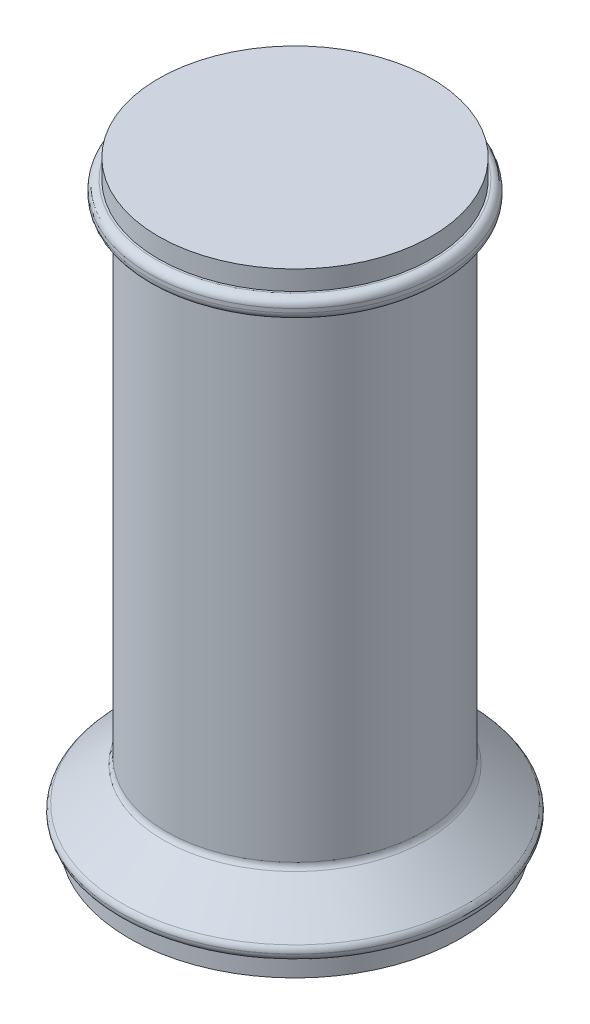
ISO-10303-21;
HEADER;
FILE_DESCRIPTION(('STEP AP214'),'2;1');
FILE_NAME('part.step','',(''),(''),'','','');
FILE_SCHEMA(('AUTOMOTIVE_DESIGN { 1 0 10303 214 1 1 1 1 }'));
ENDSEC;
DATA;
#1=APPLICATION_CONTEXT('core data for automotive mechanical design processes');
#2=APPLICATION_PROTOCOL_DEFINITION('international standard','automotive_design',2000,#1);
#3=PRODUCT_CONTEXT('',#1,'mechanical');
#4=PRODUCT('Part','Part','',(#3));
#5=PRODUCT_RELATED_PRODUCT_CATEGORY('part','',(#4));
#6=PRODUCT_DEFINITION_FORMATION('','',#4);
#7=PRODUCT_DEFINITION_CONTEXT('part definition',#1,'design');
#8=PRODUCT_DEFINITION('design','',#6,#7);
#9=PRODUCT_DEFINITION_SHAPE('','',#8);
#10=(LENGTH_UNIT() NAMED_UNIT(*) SI_UNIT(.MILLI.,.METRE.));
#11=(NAMED_UNIT(*) PLANE_ANGLE_UNIT() SI_UNIT($,.RADIAN.));
#12=(NAMED_UNIT(*) SI_UNIT($,.STERADIAN.) SOLID_ANGLE_UNIT());
#13=UNCERTAINTY_MEASURE_WITH_UNIT(LENGTH_MEASURE(1.E-05),#10,'distance_accuracy_value','');
#14=(GEOMETRIC_REPRESENTATION_CONTEXT(3) GLOBAL_UNCERTAINTY_ASSIGNED_CONTEXT((#13)) GLOBAL_UNIT_ASSIGNED_CONTEXT((#10,
#11,#12)) REPRESENTATION_CONTEXT('',''));
#15=CARTESIAN_POINT('',(0.,0.,0.));
#16=DIRECTION('',(0.,0.,1.));
#17=DIRECTION('',(1.,0.,0.));
#18=AXIS2_PLACEMENT_3D('',#15,#16,#17);
#19=CARTESIAN_POINT('',(0.,5.,0.));
#20=DIRECTION('',(0.,-1.,0.));
#21=DIRECTION('',(0.,0.,-1.));
#22=AXIS2_PLACEMENT_3D('',#19,#20,#21);
#23=CYLINDRICAL_SURFACE('',#22,42.5);
#24=CARTESIAN_POINT('',(0.,5.,0.));
#25=DIRECTION('',(0.,1.,0.));
#26=DIRECTION('',(0.,0.,1.));
#27=AXIS2_PLACEMENT_3D('',#24,#25,#26);
#28=CIRCLE('',#27,42.5);
#29=CARTESIAN_POINT('',(0.,5.,42.5));
#30=VERTEX_POINT('',#29);
#31=EDGE_CURVE('E80',#30,#30,#28,.T.);
#32=ORIENTED_EDGE('',*,*,#31,.F.);
#33=EDGE_LOOP('',(#32));
#34=FACE_BOUND('',#33,.T.);
#35=CARTESIAN_POINT('',(0.,0.,0.));
#36=DIRECTION('',(0.,1.,0.));
#37=DIRECTION('',(0.,0.,1.));
#38=AXIS2_PLACEMENT_3D('',#35,#36,#37);
#39=CIRCLE('',#38,42.5);
#40=CARTESIAN_POINT('',(0.,0.,42.5));
#41=VERTEX_POINT('',#40);
#42=EDGE_CURVE('E81',#41,#41,#39,.T.);
#43=ORIENTED_EDGE('',*,*,#42,.T.);
#44=EDGE_LOOP('',(#43));
#45=FACE_BOUND('',#44,.T.);
#46=ADVANCED_FACE('F36',(#34,#45),#23,.T.);
#47=CARTESIAN_POINT('',(0.,0.,0.));
#48=DIRECTION('',(0.,1.,0.));
#49=DIRECTION('',(0.,0.,1.));
#50=AXIS2_PLACEMENT_3D('',#47,#48,#49);
#51=PLANE('',#50);
#52=ORIENTED_EDGE('',*,*,#42,.F.);
#53=EDGE_LOOP('',(#52));
#54=FACE_BOUND('',#53,.T.);
#55=ADVANCED_FACE('F116',(#54),#51,.F.);
#56=CARTESIAN_POINT('',(0.,8.,0.));
#57=DIRECTION('',(0.,-1.,0.));
#58=DIRECTION('',(0.,0.,-1.));
#59=AXIS2_PLACEMENT_3D('',#56,#57,#58);
#60=CYLINDRICAL_SURFACE('',#59,45.);
#61=CARTESIAN_POINT('',(0.,7.,0.));
#62=DIRECTION('',(0.,1.,0.));
#63=DIRECTION('',(0.,0.,1.));
#64=AXIS2_PLACEMENT_3D('',#61,#62,#63);
#65=CIRCLE('',#64,45.);
#66=CARTESIAN_POINT('',(0.,7.,45.));
#67=VERTEX_POINT('',#66);
#68=EDGE_CURVE('E74',#67,#67,#65,.T.);
#69=ORIENTED_EDGE('',*,*,#68,.T.);
#70=EDGE_LOOP('',(#69));
#71=FACE_BOUND('',#70,.T.);
#72=CARTESIAN_POINT('',(0.,7.06325010803112,0.));
#73=DIRECTION('',(0.,-1.,0.));
#74=DIRECTION('',(0.,0.,-1.));
#75=AXIS2_PLACEMENT_3D('',#72,#73,#74);
#76=CIRCLE('',#75,45.);
#77=CARTESIAN_POINT('',(0.,7.06325010803112,-45.));
#78=VERTEX_POINT('',#77);
#79=EDGE_CURVE('E77',#78,#78,#76,.T.);
#80=ORIENTED_EDGE('',*,*,#79,.T.);
#81=EDGE_LOOP('',(#80));
#82=FACE_BOUND('',#81,.T.);
#83=ADVANCED_FACE('F122',(#71,#82),#60,.T.);
#84=CARTESIAN_POINT('',(0.,5.,0.));
#85=DIRECTION('',(0.,1.,0.));
#86=DIRECTION('',(0.,0.,1.));
#87=AXIS2_PLACEMENT_3D('',#84,#85,#86);
#88=PLANE('',#87);
#89=CARTESIAN_POINT('',(0.,5.,0.));
#90=DIRECTION('',(0.,1.,0.));
#91=DIRECTION('',(0.,0.,1.));
#92=AXIS2_PLACEMENT_3D('',#89,#90,#91);
#93=CIRCLE('',#92,43.);
#94=CARTESIAN_POINT('',(0.,5.,43.));
#95=VERTEX_POINT('',#94);
#96=EDGE_CURVE('E71',#95,#95,#93,.F.);
#97=ORIENTED_EDGE('',*,*,#96,.T.);
#98=EDGE_LOOP('',(#97));
#99=FACE_BOUND('',#98,.T.);
#100=ORIENTED_EDGE('',*,*,#31,.T.);
#101=EDGE_LOOP('',(#100));
#102=FACE_BOUND('',#101,.T.);
#103=ADVANCED_FACE('F228',(#99,#102),#88,.F.);
#104=CARTESIAN_POINT('',(0.,18.,0.));
#105=DIRECTION('',(0.,-1.,0.));
#106=DIRECTION('',(0.,0.,-1.));
#107=AXIS2_PLACEMENT_3D('',#104,#105,#106);
#108=CONICAL_SURFACE('',#107,33.,0.876058050598193);
#109=CARTESIAN_POINT('',(0.,8.59969266722588,0.));
#110=DIRECTION('',(0.,-1.,0.));
#111=DIRECTION('',(0.,0.,-1.));
#112=AXIS2_PLACEMENT_3D('',#109,#110,#111);
#113=CIRCLE('',#112,44.280368799329);
#114=CARTESIAN_POINT('',(0.,8.59969266722588,-44.280368799329));
#115=VERTEX_POINT('',#114);
#116=EDGE_CURVE('E65',#115,#115,#113,.F.);
#117=ORIENTED_EDGE('',*,*,#116,.T.);
#118=EDGE_LOOP('',(#117));
#119=FACE_BOUND('',#118,.T.);
#120=CARTESIAN_POINT('',(0.,17.4003073327741,0.));
#121=DIRECTION('',(0.,1.,0.));
#122=DIRECTION('',(0.,0.,1.));
#123=AXIS2_PLACEMENT_3D('',#120,#121,#122);
#124=CIRCLE('',#123,33.7196312006711);
#125=CARTESIAN_POINT('',(0.,17.4003073327741,33.7196312006711));
#126=VERTEX_POINT('',#125);
#127=EDGE_CURVE('E68',#126,#126,#124,.F.);
#128=ORIENTED_EDGE('',*,*,#127,.T.);
#129=EDGE_LOOP('',(#128));
#130=FACE_BOUND('',#129,.T.);
#131=ADVANCED_FACE('F219',(#119,#130),#108,.T.);
#132=CARTESIAN_POINT('',(0.,142.,0.));
#133=DIRECTION('',(0.,-1.,0.));
#134=DIRECTION('',(0.,0.,-1.));
#135=AXIS2_PLACEMENT_3D('',#132,#133,#134);
#136=CYLINDRICAL_SURFACE('',#135,33.);
#137=CARTESIAN_POINT('',(0.,140.,0.));
#138=DIRECTION('',(0.,1.,0.));
#139=DIRECTION('',(0.,0.,1.));
#140=AXIS2_PLACEMENT_3D('',#137,#138,#139);
#141=CIRCLE('',#140,33.);
#142=CARTESIAN_POINT('',(0.,140.,33.));
#143=VERTEX_POINT('',#142);
#144=EDGE_CURVE('E56',#143,#143,#141,.F.);
#145=ORIENTED_EDGE('',*,*,#144,.T.);
#146=EDGE_LOOP('',(#145));
#147=FACE_BOUND('',#146,.T.);
#148=CARTESIAN_POINT('',(0.,18.9367498919689,0.));
#149=DIRECTION('',(0.,1.,0.));
#150=DIRECTION('',(0.,0.,1.));
#151=AXIS2_PLACEMENT_3D('',#148,#149,#150);
#152=CIRCLE('',#151,33.);
#153=CARTESIAN_POINT('',(0.,18.9367498919689,33.));
#154=VERTEX_POINT('',#153);
#155=EDGE_CURVE('E59',#154,#154,#152,.T.);
#156=ORIENTED_EDGE('',*,*,#155,.T.);
#157=EDGE_LOOP('',(#156));
#158=FACE_BOUND('',#157,.T.);
#159=ADVANCED_FACE('F112',(#147,#158),#136,.T.);
#160=CARTESIAN_POINT('',(0.,147.,0.));
#161=DIRECTION('',(0.,-1.,0.));
#162=DIRECTION('',(0.,0.,-1.));
#163=AXIS2_PLACEMENT_3D('',#160,#161,#162);
#164=CYLINDRICAL_SURFACE('',#163,37.5);
#165=CARTESIAN_POINT('',(0.,144.,0.));
#166=DIRECTION('',(0.,1.,0.));
#167=DIRECTION('',(0.,0.,1.));
#168=AXIS2_PLACEMENT_3D('',#165,#166,#167);
#169=CIRCLE('',#168,37.5);
#170=CARTESIAN_POINT('',(0.,144.,37.5));
#171=VERTEX_POINT('',#170);
#172=EDGE_CURVE('E47',#171,#171,#169,.T.);
#173=ORIENTED_EDGE('',*,*,#172,.T.);
#174=EDGE_LOOP('',(#173));
#175=FACE_BOUND('',#174,.T.);
#176=CARTESIAN_POINT('',(0.,145.,0.));
#177=DIRECTION('',(0.,1.,0.));
#178=DIRECTION('',(0.,0.,1.));
#179=AXIS2_PLACEMENT_3D('',#176,#177,#178);
#180=CIRCLE('',#179,37.5);
#181=CARTESIAN_POINT('',(0.,145.,37.5));
#182=VERTEX_POINT('',#181);
#183=EDGE_CURVE('E51',#182,#182,#180,.F.);
#184=ORIENTED_EDGE('',*,*,#183,.T.);
#185=EDGE_LOOP('',(#184));
#186=FACE_BOUND('',#185,.T.);
#187=ADVANCED_FACE('F104',(#175,#186),#164,.T.);
#188=CARTESIAN_POINT('',(0.,147.,0.));
#189=DIRECTION('',(0.,1.,0.));
#190=DIRECTION('',(0.,0.,1.));
#191=AXIS2_PLACEMENT_3D('',#188,#189,#190);
#192=PLANE('',#191);
#193=CARTESIAN_POINT('',(0.,147.,0.));
#194=DIRECTION('',(0.,1.,0.));
#195=DIRECTION('',(0.,0.,1.));
#196=AXIS2_PLACEMENT_3D('',#193,#194,#195);
#197=CIRCLE('',#196,35.);
#198=CARTESIAN_POINT('',(0.,147.,35.));
#199=VERTEX_POINT('',#198);
#200=EDGE_CURVE('E87',#199,#199,#197,.T.);
#201=ORIENTED_EDGE('',*,*,#200,.F.);
#202=EDGE_LOOP('',(#201));
#203=FACE_BOUND('',#202,.T.);
#204=CARTESIAN_POINT('',(0.,147.,0.));
#205=DIRECTION('',(0.,1.,0.));
#206=DIRECTION('',(0.,0.,1.));
#207=AXIS2_PLACEMENT_3D('',#204,#205,#206);
#208=CIRCLE('',#207,35.5);
#209=CARTESIAN_POINT('',(0.,147.,35.5));
#210=VERTEX_POINT('',#209);
#211=EDGE_CURVE('E11',#210,#210,#208,.T.);
#212=ORIENTED_EDGE('',*,*,#211,.T.);
#213=EDGE_LOOP('',(#212));
#214=FACE_BOUND('',#213,.T.);
#215=ADVANCED_FACE('F101',(#203,#214),#192,.T.);
#216=CARTESIAN_POINT('',(0.,142.,0.));
#217=DIRECTION('',(0.,1.,0.));
#218=DIRECTION('',(0.,0.,1.));
#219=AXIS2_PLACEMENT_3D('',#216,#217,#218);
#220=PLANE('',#219);
#221=CARTESIAN_POINT('',(0.,142.,0.));
#222=DIRECTION('',(0.,1.,0.));
#223=DIRECTION('',(0.,0.,1.));
#224=AXIS2_PLACEMENT_3D('',#221,#222,#223);
#225=CIRCLE('',#224,35.5);
#226=CARTESIAN_POINT('',(0.,142.,35.5));
#227=VERTEX_POINT('',#226);
#228=EDGE_CURVE('E43',#227,#227,#225,.F.);
#229=ORIENTED_EDGE('',*,*,#228,.T.);
#230=EDGE_LOOP('',(#229));
#231=FACE_BOUND('',#230,.T.);
#232=CARTESIAN_POINT('',(0.,142.,0.));
#233=DIRECTION('',(0.,1.,0.));
#234=DIRECTION('',(0.,0.,1.));
#235=AXIS2_PLACEMENT_3D('',#232,#233,#234);
#236=CIRCLE('',#235,35.);
#237=CARTESIAN_POINT('',(0.,142.,35.));
#238=VERTEX_POINT('',#237);
#239=EDGE_CURVE('E62',#238,#238,#236,.T.);
#240=ORIENTED_EDGE('',*,*,#239,.T.);
#241=EDGE_LOOP('',(#240));
#242=FACE_BOUND('',#241,.T.);
#243=ADVANCED_FACE('F103',(#231,#242),#220,.F.);
#244=CARTESIAN_POINT('',(0.,7.,0.));
#245=DIRECTION('',(0.,1.,0.));
#246=DIRECTION('',(0.,0.,1.));
#247=AXIS2_PLACEMENT_3D('',#244,#245,#246);
#248=TOROIDAL_SURFACE('',#247,43.,2.);
#249=ORIENTED_EDGE('',*,*,#96,.F.);
#250=EDGE_LOOP('',(#249));
#251=FACE_BOUND('',#250,.T.);
#252=ORIENTED_EDGE('',*,*,#68,.F.);
#253=EDGE_LOOP('',(#252));
#254=FACE_BOUND('',#253,.T.);
#255=ADVANCED_FACE('F110',(#251,#254),#248,.T.);
#256=CARTESIAN_POINT('',(0.,7.06325010803112,0.));
#257=DIRECTION('',(0.,-1.,0.));
#258=DIRECTION('',(0.,0.,-1.));
#259=AXIS2_PLACEMENT_3D('',#256,#257,#258);
#260=TOROIDAL_SURFACE('',#259,43.,2.);
#261=ORIENTED_EDGE('',*,*,#79,.F.);
#262=EDGE_LOOP('',(#261));
#263=FACE_BOUND('',#262,.T.);
#264=ORIENTED_EDGE('',*,*,#116,.F.);
#265=EDGE_LOOP('',(#264));
#266=FACE_BOUND('',#265,.T.);
#267=ADVANCED_FACE('F131',(#263,#266),#260,.T.);
#268=CARTESIAN_POINT('',(0.,140.,0.));
#269=DIRECTION('',(0.,1.,0.));
#270=DIRECTION('',(0.,0.,1.));
#271=AXIS2_PLACEMENT_3D('',#268,#269,#270);
#272=TOROIDAL_SURFACE('',#271,35.,2.);
#273=ORIENTED_EDGE('',*,*,#144,.F.);
#274=EDGE_LOOP('',(#273));
#275=FACE_BOUND('',#274,.T.);
#276=ORIENTED_EDGE('',*,*,#239,.F.);
#277=EDGE_LOOP('',(#276));
#278=FACE_BOUND('',#277,.T.);
#279=ADVANCED_FACE('F135',(#275,#278),#272,.F.);
#280=CARTESIAN_POINT('',(0.,18.9367498919689,0.));
#281=DIRECTION('',(0.,1.,0.));
#282=DIRECTION('',(0.,0.,1.));
#283=AXIS2_PLACEMENT_3D('',#280,#281,#282);
#284=TOROIDAL_SURFACE('',#283,35.,2.);
#285=ORIENTED_EDGE('',*,*,#127,.F.);
#286=EDGE_LOOP('',(#285));
#287=FACE_BOUND('',#286,.T.);
#288=ORIENTED_EDGE('',*,*,#155,.F.);
#289=EDGE_LOOP('',(#288));
#290=FACE_BOUND('',#289,.T.);
#291=ADVANCED_FACE('F139',(#287,#290),#284,.F.);
#292=CARTESIAN_POINT('',(0.,144.,0.));
#293=DIRECTION('',(0.,1.,0.));
#294=DIRECTION('',(0.,0.,1.));
#295=AXIS2_PLACEMENT_3D('',#292,#293,#294);
#296=TOROIDAL_SURFACE('',#295,35.5,2.);
#297=ORIENTED_EDGE('',*,*,#228,.F.);
#298=EDGE_LOOP('',(#297));
#299=FACE_BOUND('',#298,.T.);
#300=ORIENTED_EDGE('',*,*,#172,.F.);
#301=EDGE_LOOP('',(#300));
#302=FACE_BOUND('',#301,.T.);
#303=ADVANCED_FACE('F142',(#299,#302),#296,.T.);
#304=CARTESIAN_POINT('',(0.,145.,0.));
#305=DIRECTION('',(0.,1.,0.));
#306=DIRECTION('',(0.,0.,1.));
#307=AXIS2_PLACEMENT_3D('',#304,#305,#306);
#308=TOROIDAL_SURFACE('',#307,35.5,2.);
#309=ORIENTED_EDGE('',*,*,#183,.F.);
#310=EDGE_LOOP('',(#309));
#311=FACE_BOUND('',#310,.T.);
#312=ORIENTED_EDGE('',*,*,#211,.F.);
#313=EDGE_LOOP('',(#312));
#314=FACE_BOUND('',#313,.T.);
#315=ADVANCED_FACE('F38',(#311,#314),#308,.T.);
#316=CARTESIAN_POINT('',(0.,152.,0.));
#317=DIRECTION('',(0.,-1.,0.));
#318=DIRECTION('',(0.,0.,-1.));
#319=AXIS2_PLACEMENT_3D('',#316,#317,#318);
#320=CYLINDRICAL_SURFACE('',#319,35.);
#321=CARTESIAN_POINT('',(0.,152.,0.));
#322=DIRECTION('',(0.,1.,0.));
#323=DIRECTION('',(0.,0.,1.));
#324=AXIS2_PLACEMENT_3D('',#321,#322,#323);
#325=CIRCLE('',#324,35.);
#326=CARTESIAN_POINT('',(0.,152.,35.));
#327=VERTEX_POINT('',#326);
#328=EDGE_CURVE('E84',#327,#327,#325,.T.);
#329=ORIENTED_EDGE('',*,*,#328,.F.);
#330=EDGE_LOOP('',(#329));
#331=FACE_BOUND('',#330,.T.);
#332=ORIENTED_EDGE('',*,*,#200,.T.);
#333=EDGE_LOOP('',(#332));
#334=FACE_BOUND('',#333,.T.);
#335=ADVANCED_FACE('F95',(#331,#334),#320,.T.);
#336=CARTESIAN_POINT('',(0.,152.,0.));
#337=DIRECTION('',(0.,1.,0.));
#338=DIRECTION('',(0.,0.,1.));
#339=AXIS2_PLACEMENT_3D('',#336,#337,#338);
#340=PLANE('',#339);
#341=ORIENTED_EDGE('',*,*,#328,.T.);
#342=EDGE_LOOP('',(#341));
#343=FACE_BOUND('',#342,.T.);
#344=ADVANCED_FACE('F93',(#343),#340,.T.);
#345=CLOSED_SHELL('',(#46,#55,#83,#103,#131,#159,#187,#215,#243,#255,#267,#279,#291,#303,#315,
#335,#344));
#346=MANIFOLD_SOLID_BREP('B2',#345);
#347=ADVANCED_BREP_SHAPE_REPRESENTATION('',(#18,#346),#14);
#348=SHAPE_DEFINITION_REPRESENTATION(#9,#347);
ENDSEC;
END-ISO-10303-21;
